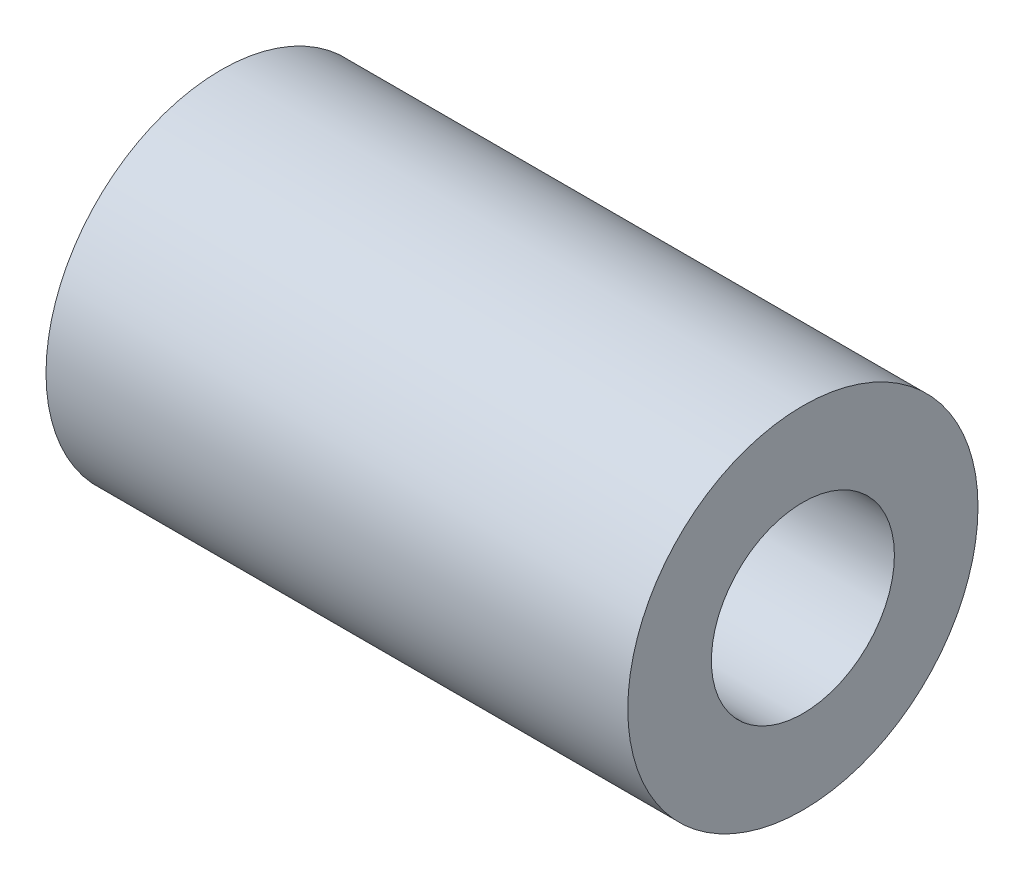
ISO-10303-21;
HEADER;
FILE_DESCRIPTION(('STEP AP214'),'2;1');
FILE_NAME('part.step','',(''),(''),'','','');
FILE_SCHEMA(('AUTOMOTIVE_DESIGN { 1 0 10303 214 1 1 1 1 }'));
ENDSEC;
DATA;
#1=APPLICATION_CONTEXT('core data for automotive mechanical design processes');
#2=APPLICATION_PROTOCOL_DEFINITION('international standard','automotive_design',2000,#1);
#3=PRODUCT_CONTEXT('',#1,'mechanical');
#4=PRODUCT('Part','Part','',(#3));
#5=PRODUCT_RELATED_PRODUCT_CATEGORY('part','',(#4));
#6=PRODUCT_DEFINITION_FORMATION('','',#4);
#7=PRODUCT_DEFINITION_CONTEXT('part definition',#1,'design');
#8=PRODUCT_DEFINITION('design','',#6,#7);
#9=PRODUCT_DEFINITION_SHAPE('','',#8);
#10=(LENGTH_UNIT() NAMED_UNIT(*) SI_UNIT(.MILLI.,.METRE.));
#11=(NAMED_UNIT(*) PLANE_ANGLE_UNIT() SI_UNIT($,.RADIAN.));
#12=(NAMED_UNIT(*) SI_UNIT($,.STERADIAN.) SOLID_ANGLE_UNIT());
#13=UNCERTAINTY_MEASURE_WITH_UNIT(LENGTH_MEASURE(1.E-05),#10,'distance_accuracy_value','');
#14=(GEOMETRIC_REPRESENTATION_CONTEXT(3) GLOBAL_UNCERTAINTY_ASSIGNED_CONTEXT((#13)) GLOBAL_UNIT_ASSIGNED_CONTEXT((#10,
#11,#12)) REPRESENTATION_CONTEXT('',''));
#15=CARTESIAN_POINT('',(0.,0.,0.));
#16=DIRECTION('',(0.,0.,1.));
#17=DIRECTION('',(1.,0.,0.));
#18=AXIS2_PLACEMENT_3D('',#15,#16,#17);
#19=CARTESIAN_POINT('',(7.9121,0.,0.));
#20=DIRECTION('',(1.,0.,0.));
#21=DIRECTION('',(0.,0.,-1.));
#22=AXIS2_PLACEMENT_3D('',#19,#20,#21);
#23=PLANE('',#22);
#24=CARTESIAN_POINT('',(7.9121,0.,0.));
#25=DIRECTION('',(1.,0.,0.));
#26=DIRECTION('',(0.,0.,-1.));
#27=AXIS2_PLACEMENT_3D('',#24,#25,#26);
#28=CIRCLE('',#27,4.7625);
#29=CARTESIAN_POINT('',(7.9121,0.,-4.7625));
#30=VERTEX_POINT('',#29);
#31=EDGE_CURVE('E10',#30,#30,#28,.T.);
#32=ORIENTED_EDGE('',*,*,#31,.T.);
#33=EDGE_LOOP('',(#32));
#34=FACE_BOUND('',#33,.T.);
#35=CARTESIAN_POINT('',(7.9121,0.,0.));
#36=DIRECTION('',(1.,0.,0.));
#37=DIRECTION('',(0.,0.,-1.));
#38=AXIS2_PLACEMENT_3D('',#35,#36,#37);
#39=CIRCLE('',#38,2.4892);
#40=CARTESIAN_POINT('',(7.9121,0.,-2.4892));
#41=VERTEX_POINT('',#40);
#42=EDGE_CURVE('E50',#41,#41,#39,.T.);
#43=ORIENTED_EDGE('',*,*,#42,.F.);
#44=EDGE_LOOP('',(#43));
#45=FACE_BOUND('',#44,.T.);
#46=ADVANCED_FACE('F39',(#34,#45),#23,.T.);
#47=CARTESIAN_POINT('',(-7.9121,0.,0.));
#48=DIRECTION('',(1.,0.,0.));
#49=DIRECTION('',(0.,0.,-1.));
#50=AXIS2_PLACEMENT_3D('',#47,#48,#49);
#51=PLANE('',#50);
#52=CARTESIAN_POINT('',(-7.9121,0.,0.));
#53=DIRECTION('',(1.,0.,0.));
#54=DIRECTION('',(0.,0.,-1.));
#55=AXIS2_PLACEMENT_3D('',#52,#53,#54);
#56=CIRCLE('',#55,4.7625);
#57=CARTESIAN_POINT('',(-7.9121,0.,-4.7625));
#58=VERTEX_POINT('',#57);
#59=EDGE_CURVE('E43',#58,#58,#56,.T.);
#60=ORIENTED_EDGE('',*,*,#59,.F.);
#61=EDGE_LOOP('',(#60));
#62=FACE_BOUND('',#61,.T.);
#63=CARTESIAN_POINT('',(-7.9121,0.,0.));
#64=DIRECTION('',(1.,0.,0.));
#65=DIRECTION('',(0.,0.,-1.));
#66=AXIS2_PLACEMENT_3D('',#63,#64,#65);
#67=CIRCLE('',#66,2.4892);
#68=CARTESIAN_POINT('',(-7.9121,0.,-2.4892));
#69=VERTEX_POINT('',#68);
#70=EDGE_CURVE('E52',#69,#69,#67,.T.);
#71=ORIENTED_EDGE('',*,*,#70,.T.);
#72=EDGE_LOOP('',(#71));
#73=FACE_BOUND('',#72,.T.);
#74=ADVANCED_FACE('F62',(#62,#73),#51,.F.);
#75=CARTESIAN_POINT('',(7.9121,0.,0.));
#76=DIRECTION('',(-1.,0.,0.));
#77=DIRECTION('',(0.,0.,1.));
#78=AXIS2_PLACEMENT_3D('',#75,#76,#77);
#79=CYLINDRICAL_SURFACE('',#78,4.7625);
#80=ORIENTED_EDGE('',*,*,#31,.F.);
#81=EDGE_LOOP('',(#80));
#82=FACE_BOUND('',#81,.T.);
#83=ORIENTED_EDGE('',*,*,#59,.T.);
#84=EDGE_LOOP('',(#83));
#85=FACE_BOUND('',#84,.T.);
#86=ADVANCED_FACE('F41',(#82,#85),#79,.T.);
#87=CARTESIAN_POINT('',(7.9121,0.,0.));
#88=DIRECTION('',(-1.,0.,0.));
#89=DIRECTION('',(0.,0.,1.));
#90=AXIS2_PLACEMENT_3D('',#87,#88,#89);
#91=CYLINDRICAL_SURFACE('',#90,2.4892);
#92=ORIENTED_EDGE('',*,*,#42,.T.);
#93=EDGE_LOOP('',(#92));
#94=FACE_BOUND('',#93,.T.);
#95=ORIENTED_EDGE('',*,*,#70,.F.);
#96=EDGE_LOOP('',(#95));
#97=FACE_BOUND('',#96,.T.);
#98=ADVANCED_FACE('F58',(#94,#97),#91,.F.);
#99=CLOSED_SHELL('',(#46,#74,#86,#98));
#100=MANIFOLD_SOLID_BREP('B2',#99);
#101=ADVANCED_BREP_SHAPE_REPRESENTATION('',(#18,#100),#14);
#102=SHAPE_DEFINITION_REPRESENTATION(#9,#101);
ENDSEC;
END-ISO-10303-21;
